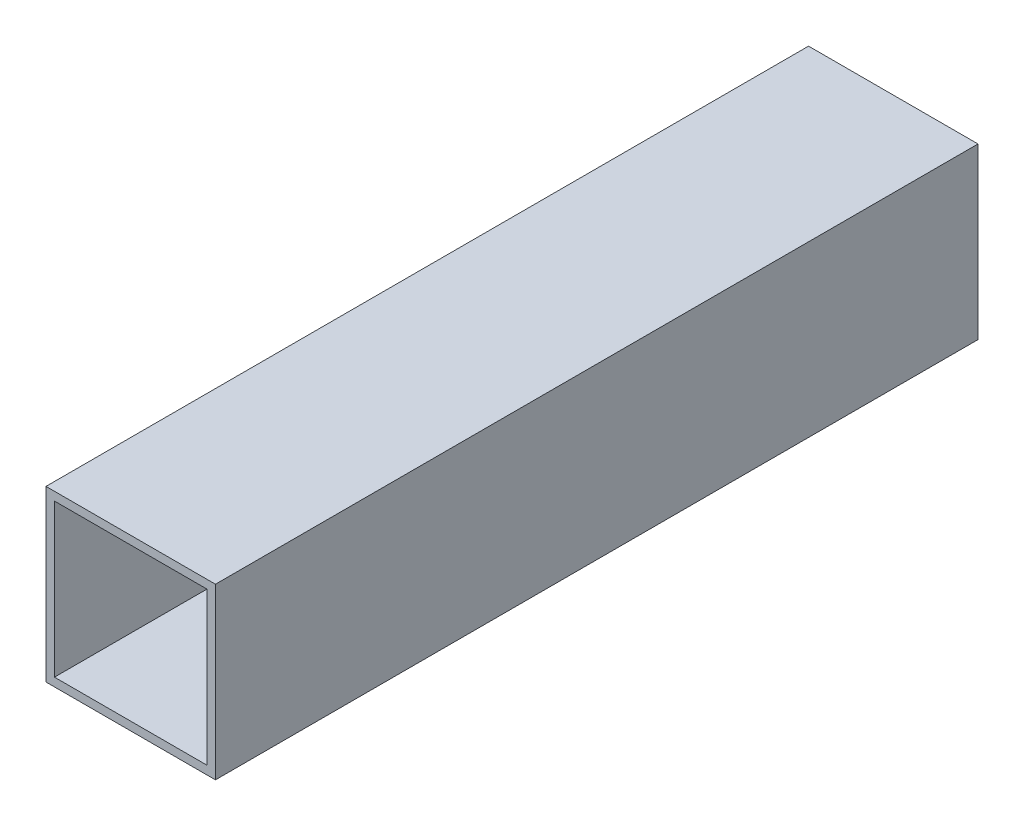
ISO-10303-21;
HEADER;
FILE_DESCRIPTION(('STEP AP214'),'2;1');
FILE_NAME('part.step','',(''),(''),'','','');
FILE_SCHEMA(('AUTOMOTIVE_DESIGN { 1 0 10303 214 1 1 1 1 }'));
ENDSEC;
DATA;
#1=APPLICATION_CONTEXT('core data for automotive mechanical design processes');
#2=APPLICATION_PROTOCOL_DEFINITION('international standard','automotive_design',2000,#1);
#3=PRODUCT_CONTEXT('',#1,'mechanical');
#4=PRODUCT('Part','Part','',(#3));
#5=PRODUCT_RELATED_PRODUCT_CATEGORY('part','',(#4));
#6=PRODUCT_DEFINITION_FORMATION('','',#4);
#7=PRODUCT_DEFINITION_CONTEXT('part definition',#1,'design');
#8=PRODUCT_DEFINITION('design','',#6,#7);
#9=PRODUCT_DEFINITION_SHAPE('','',#8);
#10=(LENGTH_UNIT() NAMED_UNIT(*) SI_UNIT(.MILLI.,.METRE.));
#11=(NAMED_UNIT(*) PLANE_ANGLE_UNIT() SI_UNIT($,.RADIAN.));
#12=(NAMED_UNIT(*) SI_UNIT($,.STERADIAN.) SOLID_ANGLE_UNIT());
#13=UNCERTAINTY_MEASURE_WITH_UNIT(LENGTH_MEASURE(1.E-05),#10,'distance_accuracy_value','');
#14=(GEOMETRIC_REPRESENTATION_CONTEXT(3) GLOBAL_UNCERTAINTY_ASSIGNED_CONTEXT((#13)) GLOBAL_UNIT_ASSIGNED_CONTEXT((#10,
#11,#12)) REPRESENTATION_CONTEXT('',''));
#15=CARTESIAN_POINT('',(0.,0.,0.));
#16=DIRECTION('',(0.,0.,1.));
#17=DIRECTION('',(1.,0.,0.));
#18=AXIS2_PLACEMENT_3D('',#15,#16,#17);
#19=CARTESIAN_POINT('',(0.,0.,225.));
#20=DIRECTION('',(0.,0.,-1.));
#21=DIRECTION('',(-1.,0.,0.));
#22=AXIS2_PLACEMENT_3D('',#19,#20,#21);
#23=PLANE('',#22);
#24=DIRECTION('',(0.,-1.,0.));
#25=VECTOR('',#24,1.);
#26=CARTESIAN_POINT('',(-50.,-50.,225.));
#27=LINE('',#26,#25);
#28=CARTESIAN_POINT('',(-50.,49.9999999999999,225.));
#29=VERTEX_POINT('',#28);
#30=CARTESIAN_POINT('',(-50.,-50.,225.));
#31=VERTEX_POINT('',#30);
#32=EDGE_CURVE('E133',#29,#31,#27,.T.);
#33=ORIENTED_EDGE('',*,*,#32,.T.);
#34=DIRECTION('',(1.,0.,0.));
#35=VECTOR('',#34,1.);
#36=CARTESIAN_POINT('',(-50.,-50.,225.));
#37=LINE('',#36,#35);
#38=CARTESIAN_POINT('',(50.,-50.,225.));
#39=VERTEX_POINT('',#38);
#40=EDGE_CURVE('E136',#31,#39,#37,.T.);
#41=ORIENTED_EDGE('',*,*,#40,.T.);
#42=DIRECTION('',(0.,1.,0.));
#43=VECTOR('',#42,1.);
#44=CARTESIAN_POINT('',(50.,-50.,225.));
#45=LINE('',#44,#43);
#46=CARTESIAN_POINT('',(49.9999999999999,49.9999999999999,225.));
#47=VERTEX_POINT('',#46);
#48=EDGE_CURVE('E139',#39,#47,#45,.T.);
#49=ORIENTED_EDGE('',*,*,#48,.T.);
#50=DIRECTION('',(-1.,0.,0.));
#51=VECTOR('',#50,1.);
#52=CARTESIAN_POINT('',(-50.,49.9999999999999,225.));
#53=LINE('',#52,#51);
#54=EDGE_CURVE('E141',#47,#29,#53,.T.);
#55=ORIENTED_EDGE('',*,*,#54,.T.);
#56=EDGE_LOOP('',(#33,#41,#49,#55));
#57=FACE_BOUND('',#56,.T.);
#58=DIRECTION('',(0.,-1.,0.));
#59=VECTOR('',#58,1.);
#60=CARTESIAN_POINT('',(-45.,-45.,225.));
#61=LINE('',#60,#59);
#62=CARTESIAN_POINT('',(-45.,44.9999999999999,225.));
#63=VERTEX_POINT('',#62);
#64=CARTESIAN_POINT('',(-45.,-45.,225.));
#65=VERTEX_POINT('',#64);
#66=EDGE_CURVE('E97',#63,#65,#61,.T.);
#67=ORIENTED_EDGE('',*,*,#66,.F.);
#68=DIRECTION('',(-1.,0.,0.));
#69=VECTOR('',#68,1.);
#70=CARTESIAN_POINT('',(-45.,44.9999999999999,225.));
#71=LINE('',#70,#69);
#72=CARTESIAN_POINT('',(45.,44.9999999999999,225.));
#73=VERTEX_POINT('',#72);
#74=EDGE_CURVE('E119',#73,#63,#71,.T.);
#75=ORIENTED_EDGE('',*,*,#74,.F.);
#76=DIRECTION('',(0.,1.,0.));
#77=VECTOR('',#76,1.);
#78=CARTESIAN_POINT('',(45.,-45.,225.));
#79=LINE('',#78,#77);
#80=CARTESIAN_POINT('',(45.,-45.,225.));
#81=VERTEX_POINT('',#80);
#82=EDGE_CURVE('E117',#81,#73,#79,.T.);
#83=ORIENTED_EDGE('',*,*,#82,.F.);
#84=DIRECTION('',(1.,0.,0.));
#85=VECTOR('',#84,1.);
#86=CARTESIAN_POINT('',(-45.,-45.,225.));
#87=LINE('',#86,#85);
#88=EDGE_CURVE('E105',#65,#81,#87,.T.);
#89=ORIENTED_EDGE('',*,*,#88,.F.);
#90=EDGE_LOOP('',(#67,#75,#83,#89));
#91=FACE_BOUND('',#90,.T.);
#92=ADVANCED_FACE('F32',(#57,#91),#23,.F.);
#93=CARTESIAN_POINT('',(0.,0.,-225.));
#94=DIRECTION('',(0.,0.,-1.));
#95=DIRECTION('',(-1.,0.,0.));
#96=AXIS2_PLACEMENT_3D('',#93,#94,#95);
#97=PLANE('',#96);
#98=DIRECTION('',(0.,-1.,0.));
#99=VECTOR('',#98,1.);
#100=CARTESIAN_POINT('',(-50.,-50.,-225.));
#101=LINE('',#100,#99);
#102=CARTESIAN_POINT('',(-50.,49.9999999999999,-225.));
#103=VERTEX_POINT('',#102);
#104=CARTESIAN_POINT('',(-50.,-50.,-225.));
#105=VERTEX_POINT('',#104);
#106=EDGE_CURVE('E113',#103,#105,#101,.T.);
#107=ORIENTED_EDGE('',*,*,#106,.F.);
#108=DIRECTION('',(-1.,0.,0.));
#109=VECTOR('',#108,1.);
#110=CARTESIAN_POINT('',(-50.,49.9999999999999,-225.));
#111=LINE('',#110,#109);
#112=CARTESIAN_POINT('',(49.9999999999999,49.9999999999999,-225.));
#113=VERTEX_POINT('',#112);
#114=EDGE_CURVE('E137',#113,#103,#111,.T.);
#115=ORIENTED_EDGE('',*,*,#114,.F.);
#116=DIRECTION('',(0.,1.,0.));
#117=VECTOR('',#116,1.);
#118=CARTESIAN_POINT('',(50.,-50.,-225.));
#119=LINE('',#118,#117);
#120=CARTESIAN_POINT('',(50.,-50.,-225.));
#121=VERTEX_POINT('',#120);
#122=EDGE_CURVE('E148',#121,#113,#119,.T.);
#123=ORIENTED_EDGE('',*,*,#122,.F.);
#124=DIRECTION('',(1.,0.,0.));
#125=VECTOR('',#124,1.);
#126=CARTESIAN_POINT('',(-50.,-50.,-225.));
#127=LINE('',#126,#125);
#128=EDGE_CURVE('E146',#105,#121,#127,.T.);
#129=ORIENTED_EDGE('',*,*,#128,.F.);
#130=EDGE_LOOP('',(#107,#115,#123,#129));
#131=FACE_BOUND('',#130,.T.);
#132=DIRECTION('',(-1.,0.,0.));
#133=VECTOR('',#132,1.);
#134=CARTESIAN_POINT('',(-45.,44.9999999999999,-225.));
#135=LINE('',#134,#133);
#136=CARTESIAN_POINT('',(45.,44.9999999999999,-225.));
#137=VERTEX_POINT('',#136);
#138=CARTESIAN_POINT('',(-45.,44.9999999999999,-225.));
#139=VERTEX_POINT('',#138);
#140=EDGE_CURVE('E106',#137,#139,#135,.T.);
#141=ORIENTED_EDGE('',*,*,#140,.T.);
#142=DIRECTION('',(0.,-1.,0.));
#143=VECTOR('',#142,1.);
#144=CARTESIAN_POINT('',(-45.,-45.,-225.));
#145=LINE('',#144,#143);
#146=CARTESIAN_POINT('',(-45.,-45.,-225.));
#147=VERTEX_POINT('',#146);
#148=EDGE_CURVE('E55',#139,#147,#145,.T.);
#149=ORIENTED_EDGE('',*,*,#148,.T.);
#150=DIRECTION('',(1.,0.,0.));
#151=VECTOR('',#150,1.);
#152=CARTESIAN_POINT('',(-45.,-45.,-225.));
#153=LINE('',#152,#151);
#154=CARTESIAN_POINT('',(45.,-45.,-225.));
#155=VERTEX_POINT('',#154);
#156=EDGE_CURVE('E112',#147,#155,#153,.T.);
#157=ORIENTED_EDGE('',*,*,#156,.T.);
#158=DIRECTION('',(0.,1.,0.));
#159=VECTOR('',#158,1.);
#160=CARTESIAN_POINT('',(45.,-45.,-225.));
#161=LINE('',#160,#159);
#162=EDGE_CURVE('E125',#155,#137,#161,.T.);
#163=ORIENTED_EDGE('',*,*,#162,.T.);
#164=EDGE_LOOP('',(#141,#149,#157,#163));
#165=FACE_BOUND('',#164,.T.);
#166=ADVANCED_FACE('F166',(#131,#165),#97,.T.);
#167=CARTESIAN_POINT('',(-50.,-50.,225.));
#168=DIRECTION('',(1.,0.,0.));
#169=DIRECTION('',(0.,0.,-1.));
#170=AXIS2_PLACEMENT_3D('',#167,#168,#169);
#171=PLANE('',#170);
#172=ORIENTED_EDGE('',*,*,#106,.T.);
#173=DIRECTION('',(0.,0.,-1.));
#174=VECTOR('',#173,1.);
#175=CARTESIAN_POINT('',(-50.,-50.,225.));
#176=LINE('',#175,#174);
#177=EDGE_CURVE('E11',#31,#105,#176,.T.);
#178=ORIENTED_EDGE('',*,*,#177,.F.);
#179=ORIENTED_EDGE('',*,*,#32,.F.);
#180=DIRECTION('',(0.,0.,-1.));
#181=VECTOR('',#180,1.);
#182=CARTESIAN_POINT('',(-50.,49.9999999999999,225.));
#183=LINE('',#182,#181);
#184=EDGE_CURVE('E143',#29,#103,#183,.T.);
#185=ORIENTED_EDGE('',*,*,#184,.T.);
#186=EDGE_LOOP('',(#172,#178,#179,#185));
#187=FACE_BOUND('',#186,.T.);
#188=ADVANCED_FACE('F34',(#187),#171,.F.);
#189=CARTESIAN_POINT('',(-50.,-50.,225.));
#190=DIRECTION('',(0.,1.,0.));
#191=DIRECTION('',(0.,0.,1.));
#192=AXIS2_PLACEMENT_3D('',#189,#190,#191);
#193=PLANE('',#192);
#194=ORIENTED_EDGE('',*,*,#128,.T.);
#195=DIRECTION('',(0.,0.,-1.));
#196=VECTOR('',#195,1.);
#197=CARTESIAN_POINT('',(50.,-50.,225.));
#198=LINE('',#197,#196);
#199=EDGE_CURVE('E40',#39,#121,#198,.T.);
#200=ORIENTED_EDGE('',*,*,#199,.F.);
#201=ORIENTED_EDGE('',*,*,#40,.F.);
#202=ORIENTED_EDGE('',*,*,#177,.T.);
#203=EDGE_LOOP('',(#194,#200,#201,#202));
#204=FACE_BOUND('',#203,.T.);
#205=ADVANCED_FACE('F176',(#204),#193,.F.);
#206=CARTESIAN_POINT('',(50.,-50.,225.));
#207=DIRECTION('',(-1.,0.,0.));
#208=DIRECTION('',(0.,-1.,0.));
#209=AXIS2_PLACEMENT_3D('',#206,#207,#208);
#210=PLANE('',#209);
#211=ORIENTED_EDGE('',*,*,#122,.T.);
#212=DIRECTION('',(0.,0.,-1.));
#213=VECTOR('',#212,1.);
#214=CARTESIAN_POINT('',(49.9999999999999,49.9999999999999,225.));
#215=LINE('',#214,#213);
#216=EDGE_CURVE('E153',#47,#113,#215,.T.);
#217=ORIENTED_EDGE('',*,*,#216,.F.);
#218=ORIENTED_EDGE('',*,*,#48,.F.);
#219=ORIENTED_EDGE('',*,*,#199,.T.);
#220=EDGE_LOOP('',(#211,#217,#218,#219));
#221=FACE_BOUND('',#220,.T.);
#222=ADVANCED_FACE('F160',(#221),#210,.F.);
#223=CARTESIAN_POINT('',(-50.,49.9999999999999,225.));
#224=DIRECTION('',(0.,-1.,0.));
#225=DIRECTION('',(0.,0.,-1.));
#226=AXIS2_PLACEMENT_3D('',#223,#224,#225);
#227=PLANE('',#226);
#228=ORIENTED_EDGE('',*,*,#114,.T.);
#229=ORIENTED_EDGE('',*,*,#184,.F.);
#230=ORIENTED_EDGE('',*,*,#54,.F.);
#231=ORIENTED_EDGE('',*,*,#216,.T.);
#232=EDGE_LOOP('',(#228,#229,#230,#231));
#233=FACE_BOUND('',#232,.T.);
#234=ADVANCED_FACE('F170',(#233),#227,.F.);
#235=CARTESIAN_POINT('',(-45.,-45.,225.));
#236=DIRECTION('',(1.,0.,0.));
#237=DIRECTION('',(0.,0.,-1.));
#238=AXIS2_PLACEMENT_3D('',#235,#236,#237);
#239=PLANE('',#238);
#240=ORIENTED_EDGE('',*,*,#148,.F.);
#241=DIRECTION('',(0.,0.,-1.));
#242=VECTOR('',#241,1.);
#243=CARTESIAN_POINT('',(-45.,44.9999999999999,225.));
#244=LINE('',#243,#242);
#245=EDGE_CURVE('E101',#63,#139,#244,.T.);
#246=ORIENTED_EDGE('',*,*,#245,.F.);
#247=ORIENTED_EDGE('',*,*,#66,.T.);
#248=DIRECTION('',(0.,0.,-1.));
#249=VECTOR('',#248,1.);
#250=CARTESIAN_POINT('',(-45.,-45.,225.));
#251=LINE('',#250,#249);
#252=EDGE_CURVE('E100',#65,#147,#251,.T.);
#253=ORIENTED_EDGE('',*,*,#252,.T.);
#254=EDGE_LOOP('',(#240,#246,#247,#253));
#255=FACE_BOUND('',#254,.T.);
#256=ADVANCED_FACE('F99',(#255),#239,.T.);
#257=CARTESIAN_POINT('',(-45.,-45.,225.));
#258=DIRECTION('',(0.,1.,0.));
#259=DIRECTION('',(0.,0.,1.));
#260=AXIS2_PLACEMENT_3D('',#257,#258,#259);
#261=PLANE('',#260);
#262=ORIENTED_EDGE('',*,*,#156,.F.);
#263=ORIENTED_EDGE('',*,*,#252,.F.);
#264=ORIENTED_EDGE('',*,*,#88,.T.);
#265=DIRECTION('',(0.,0.,-1.));
#266=VECTOR('',#265,1.);
#267=CARTESIAN_POINT('',(45.,-45.,225.));
#268=LINE('',#267,#266);
#269=EDGE_CURVE('E114',#81,#155,#268,.T.);
#270=ORIENTED_EDGE('',*,*,#269,.T.);
#271=EDGE_LOOP('',(#262,#263,#264,#270));
#272=FACE_BOUND('',#271,.T.);
#273=ADVANCED_FACE('F109',(#272),#261,.T.);
#274=CARTESIAN_POINT('',(45.,-45.,225.));
#275=DIRECTION('',(-1.,0.,0.));
#276=DIRECTION('',(0.,-1.,0.));
#277=AXIS2_PLACEMENT_3D('',#274,#275,#276);
#278=PLANE('',#277);
#279=ORIENTED_EDGE('',*,*,#162,.F.);
#280=ORIENTED_EDGE('',*,*,#269,.F.);
#281=ORIENTED_EDGE('',*,*,#82,.T.);
#282=DIRECTION('',(0.,0.,-1.));
#283=VECTOR('',#282,1.);
#284=CARTESIAN_POINT('',(45.,44.9999999999999,225.));
#285=LINE('',#284,#283);
#286=EDGE_CURVE('E47',#73,#137,#285,.T.);
#287=ORIENTED_EDGE('',*,*,#286,.T.);
#288=EDGE_LOOP('',(#279,#280,#281,#287));
#289=FACE_BOUND('',#288,.T.);
#290=ADVANCED_FACE('F199',(#289),#278,.T.);
#291=CARTESIAN_POINT('',(-45.,44.9999999999999,225.));
#292=DIRECTION('',(0.,-1.,0.));
#293=DIRECTION('',(0.,0.,-1.));
#294=AXIS2_PLACEMENT_3D('',#291,#292,#293);
#295=PLANE('',#294);
#296=ORIENTED_EDGE('',*,*,#140,.F.);
#297=ORIENTED_EDGE('',*,*,#286,.F.);
#298=ORIENTED_EDGE('',*,*,#74,.T.);
#299=ORIENTED_EDGE('',*,*,#245,.T.);
#300=EDGE_LOOP('',(#296,#297,#298,#299));
#301=FACE_BOUND('',#300,.T.);
#302=ADVANCED_FACE('F203',(#301),#295,.T.);
#303=CLOSED_SHELL('',(#92,#166,#188,#205,#222,#234,#256,#273,#290,#302));
#304=MANIFOLD_SOLID_BREP('B2',#303);
#305=ADVANCED_BREP_SHAPE_REPRESENTATION('',(#18,#304),#14);
#306=SHAPE_DEFINITION_REPRESENTATION(#9,#305);
ENDSEC;
END-ISO-10303-21;
